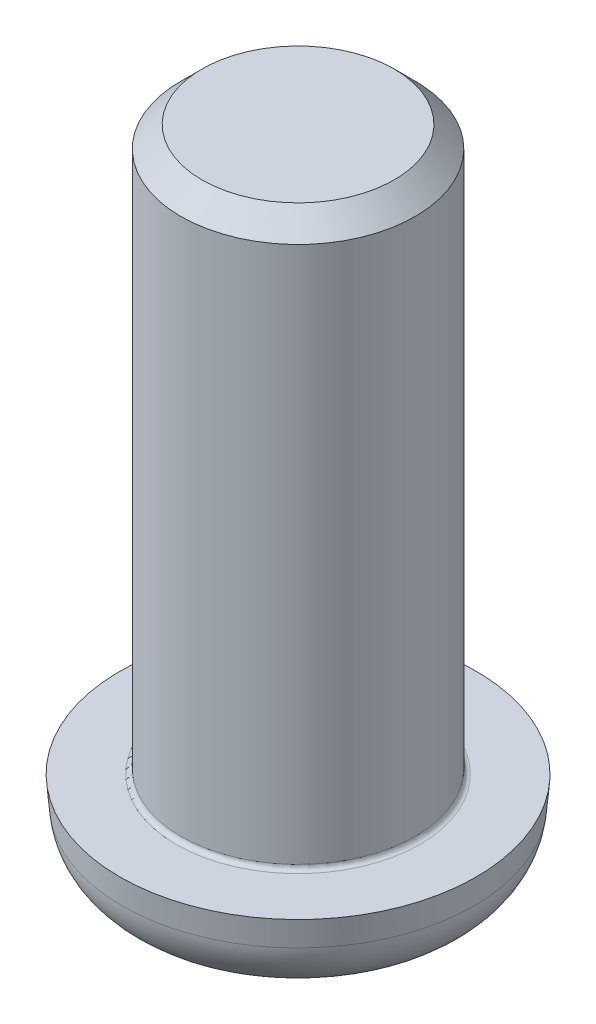
ISO-10303-21;
HEADER;
FILE_DESCRIPTION(('STEP AP214'),'2;1');
FILE_NAME('part.step','',(''),(''),'','','');
FILE_SCHEMA(('AUTOMOTIVE_DESIGN { 1 0 10303 214 1 1 1 1 }'));
ENDSEC;
DATA;
#1=APPLICATION_CONTEXT('core data for automotive mechanical design processes');
#2=APPLICATION_PROTOCOL_DEFINITION('international standard','automotive_design',2000,#1);
#3=PRODUCT_CONTEXT('',#1,'mechanical');
#4=PRODUCT('Part','Part','',(#3));
#5=PRODUCT_RELATED_PRODUCT_CATEGORY('part','',(#4));
#6=PRODUCT_DEFINITION_FORMATION('','',#4);
#7=PRODUCT_DEFINITION_CONTEXT('part definition',#1,'design');
#8=PRODUCT_DEFINITION('design','',#6,#7);
#9=PRODUCT_DEFINITION_SHAPE('','',#8);
#10=(LENGTH_UNIT() NAMED_UNIT(*) SI_UNIT(.MILLI.,.METRE.));
#11=(NAMED_UNIT(*) PLANE_ANGLE_UNIT() SI_UNIT($,.RADIAN.));
#12=(NAMED_UNIT(*) SI_UNIT($,.STERADIAN.) SOLID_ANGLE_UNIT());
#13=UNCERTAINTY_MEASURE_WITH_UNIT(LENGTH_MEASURE(1.E-05),#10,'distance_accuracy_value','');
#14=(GEOMETRIC_REPRESENTATION_CONTEXT(3) GLOBAL_UNCERTAINTY_ASSIGNED_CONTEXT((#13)) GLOBAL_UNIT_ASSIGNED_CONTEXT((#10,
#11,#12)) REPRESENTATION_CONTEXT('',''));
#15=CARTESIAN_POINT('',(0.,0.,0.));
#16=DIRECTION('',(0.,0.,1.));
#17=DIRECTION('',(1.,0.,0.));
#18=AXIS2_PLACEMENT_3D('',#15,#16,#17);
#19=CARTESIAN_POINT('',(0.,0.,1.25));
#20=DIRECTION('',(0.,1.,0.));
#21=DIRECTION('',(0.,0.,1.));
#22=AXIS2_PLACEMENT_3D('',#19,#20,#21);
#23=PLANE('',#22);
#24=CARTESIAN_POINT('',(0.,0.,0.));
#25=DIRECTION('',(0.,1.,0.));
#26=DIRECTION('',(0.,0.,1.));
#27=AXIS2_PLACEMENT_3D('',#24,#25,#26);
#28=CIRCLE('',#27,1.3);
#29=CARTESIAN_POINT('',(0.,0.,1.3));
#30=VERTEX_POINT('',#29);
#31=EDGE_CURVE('E245',#30,#30,#28,.F.);
#32=ORIENTED_EDGE('',*,*,#31,.T.);
#33=EDGE_LOOP('',(#32));
#34=FACE_BOUND('',#33,.T.);
#35=CARTESIAN_POINT('',(0.,0.,0.));
#36=DIRECTION('',(0.,1.,0.));
#37=DIRECTION('',(0.,0.,1.));
#38=AXIS2_PLACEMENT_3D('',#35,#36,#37);
#39=CIRCLE('',#38,1.9);
#40=CARTESIAN_POINT('',(0.,0.,1.9));
#41=VERTEX_POINT('',#40);
#42=EDGE_CURVE('E233',#41,#41,#39,.T.);
#43=ORIENTED_EDGE('',*,*,#42,.T.);
#44=EDGE_LOOP('',(#43));
#45=FACE_BOUND('',#44,.T.);
#46=ADVANCED_FACE('F37',(#34,#45),#23,.T.);
#47=CARTESIAN_POINT('',(0.,0.,0.));
#48=DIRECTION('',(0.,1.,0.));
#49=DIRECTION('',(0.,0.,1.));
#50=AXIS2_PLACEMENT_3D('',#47,#48,#49);
#51=CONICAL_SURFACE('',#50,1.9,0.0872664625997169);
#52=CARTESIAN_POINT('',(0.,-0.28,0.));
#53=DIRECTION('',(0.,1.,0.));
#54=DIRECTION('',(0.,0.,1.));
#55=AXIS2_PLACEMENT_3D('',#52,#53,#54);
#56=CIRCLE('',#55,1.87550317421274);
#57=CARTESIAN_POINT('',(0.,-0.28,1.87550317421274));
#58=VERTEX_POINT('',#57);
#59=EDGE_CURVE('E181',#58,#58,#56,.T.);
#60=ORIENTED_EDGE('',*,*,#59,.T.);
#61=EDGE_LOOP('',(#60));
#62=FACE_BOUND('',#61,.T.);
#63=ORIENTED_EDGE('',*,*,#42,.F.);
#64=EDGE_LOOP('',(#63));
#65=FACE_BOUND('',#64,.T.);
#66=ADVANCED_FACE('F262',(#62,#65),#51,.T.);
#67=CARTESIAN_POINT('',(0.,-0.224011361782265,0.));
#68=DIRECTION('',(0.,1.,0.));
#69=DIRECTION('',(0.,0.,1.));
#70=AXIS2_PLACEMENT_3D('',#67,#68,#69);
#71=TOROIDAL_SURFACE('',#70,1.23555011102365,0.642397579925844);
#72=CARTESIAN_POINT('',(0.,-0.769977710221994,0.));
#73=DIRECTION('',(0.,1.,0.));
#74=DIRECTION('',(0.,0.,1.));
#75=AXIS2_PLACEMENT_3D('',#72,#73,#74);
#76=CIRCLE('',#75,1.57406953006186);
#77=CARTESIAN_POINT('',(0.,-0.769977710221994,1.57406953006186));
#78=VERTEX_POINT('',#77);
#79=EDGE_CURVE('E236',#78,#78,#76,.T.);
#80=ORIENTED_EDGE('',*,*,#79,.T.);
#81=EDGE_LOOP('',(#80));
#82=FACE_BOUND('',#81,.T.);
#83=ORIENTED_EDGE('',*,*,#59,.F.);
#84=EDGE_LOOP('',(#83));
#85=FACE_BOUND('',#84,.T.);
#86=ADVANCED_FACE('F268',(#82,#85),#71,.T.);
#87=CARTESIAN_POINT('',(0.,-0.8,0.));
#88=DIRECTION('',(0.,-1.,0.));
#89=DIRECTION('',(0.,0.,-1.));
#90=AXIS2_PLACEMENT_3D('',#87,#88,#89);
#91=PLANE('',#90);
#92=DIRECTION('',(0.,0.,-1.));
#93=VECTOR('',#92,1.);
#94=CARTESIAN_POINT('',(-0.1785,-0.8,1.05));
#95=LINE('',#94,#93);
#96=CARTESIAN_POINT('',(-0.1785,-0.8,1.05));
#97=VERTEX_POINT('',#96);
#98=CARTESIAN_POINT('',(-0.1785,-0.8,0.1785));
#99=VERTEX_POINT('',#98);
#100=EDGE_CURVE('E52',#97,#99,#95,.T.);
#101=ORIENTED_EDGE('',*,*,#100,.F.);
#102=DIRECTION('',(-1.,0.,0.));
#103=VECTOR('',#102,1.);
#104=CARTESIAN_POINT('',(-0.1785,-0.8,1.05));
#105=LINE('',#104,#103);
#106=CARTESIAN_POINT('',(0.1785,-0.8,1.05));
#107=VERTEX_POINT('',#106);
#108=EDGE_CURVE('E177',#107,#97,#105,.T.);
#109=ORIENTED_EDGE('',*,*,#108,.F.);
#110=DIRECTION('',(0.,0.,1.));
#111=VECTOR('',#110,1.);
#112=CARTESIAN_POINT('',(0.1785,-0.8,1.05));
#113=LINE('',#112,#111);
#114=CARTESIAN_POINT('',(0.178500000000001,-0.8,0.1785));
#115=VERTEX_POINT('',#114);
#116=EDGE_CURVE('E175',#115,#107,#113,.T.);
#117=ORIENTED_EDGE('',*,*,#116,.F.);
#118=DIRECTION('',(-1.,0.,0.));
#119=VECTOR('',#118,1.);
#120=CARTESIAN_POINT('',(0.178500000000001,-0.8,0.1785));
#121=LINE('',#120,#119);
#122=CARTESIAN_POINT('',(1.05,-0.8,0.1785));
#123=VERTEX_POINT('',#122);
#124=EDGE_CURVE('E172',#123,#115,#121,.T.);
#125=ORIENTED_EDGE('',*,*,#124,.F.);
#126=DIRECTION('',(0.,0.,1.));
#127=VECTOR('',#126,1.);
#128=CARTESIAN_POINT('',(1.05,-0.8,0.1785));
#129=LINE('',#128,#127);
#130=CARTESIAN_POINT('',(1.05,-0.8,-0.1785));
#131=VERTEX_POINT('',#130);
#132=EDGE_CURVE('E169',#131,#123,#129,.T.);
#133=ORIENTED_EDGE('',*,*,#132,.F.);
#134=DIRECTION('',(1.,0.,0.));
#135=VECTOR('',#134,1.);
#136=CARTESIAN_POINT('',(0.178500000000001,-0.8,-0.1785));
#137=LINE('',#136,#135);
#138=CARTESIAN_POINT('',(0.178500000000001,-0.8,-0.1785));
#139=VERTEX_POINT('',#138);
#140=EDGE_CURVE('E166',#139,#131,#137,.T.);
#141=ORIENTED_EDGE('',*,*,#140,.F.);
#142=DIRECTION('',(0.,0.,1.));
#143=VECTOR('',#142,1.);
#144=CARTESIAN_POINT('',(0.178500000000001,-0.8,-0.1785));
#145=LINE('',#144,#143);
#146=CARTESIAN_POINT('',(0.178500000000001,-0.8,-1.05));
#147=VERTEX_POINT('',#146);
#148=EDGE_CURVE('E163',#147,#139,#145,.T.);
#149=ORIENTED_EDGE('',*,*,#148,.F.);
#150=DIRECTION('',(1.,0.,0.));
#151=VECTOR('',#150,1.);
#152=CARTESIAN_POINT('',(-0.1785,-0.8,-1.05));
#153=LINE('',#152,#151);
#154=CARTESIAN_POINT('',(-0.1785,-0.8,-1.05));
#155=VERTEX_POINT('',#154);
#156=EDGE_CURVE('E160',#155,#147,#153,.T.);
#157=ORIENTED_EDGE('',*,*,#156,.F.);
#158=DIRECTION('',(0.,0.,-1.));
#159=VECTOR('',#158,1.);
#160=CARTESIAN_POINT('',(-0.1785,-0.8,-0.1785));
#161=LINE('',#160,#159);
#162=CARTESIAN_POINT('',(-0.1785,-0.8,-0.1785));
#163=VERTEX_POINT('',#162);
#164=EDGE_CURVE('E154',#163,#155,#161,.T.);
#165=ORIENTED_EDGE('',*,*,#164,.F.);
#166=DIRECTION('',(1.,0.,0.));
#167=VECTOR('',#166,1.);
#168=CARTESIAN_POINT('',(-1.05,-0.8,-0.1785));
#169=LINE('',#168,#167);
#170=CARTESIAN_POINT('',(-1.05,-0.8,-0.1785));
#171=VERTEX_POINT('',#170);
#172=EDGE_CURVE('E152',#171,#163,#169,.T.);
#173=ORIENTED_EDGE('',*,*,#172,.F.);
#174=DIRECTION('',(0.,0.,-1.));
#175=VECTOR('',#174,1.);
#176=CARTESIAN_POINT('',(-1.05,-0.8,0.1785));
#177=LINE('',#176,#175);
#178=CARTESIAN_POINT('',(-1.05,-0.8,0.1785));
#179=VERTEX_POINT('',#178);
#180=EDGE_CURVE('E135',#179,#171,#177,.T.);
#181=ORIENTED_EDGE('',*,*,#180,.F.);
#182=DIRECTION('',(-1.,0.,0.));
#183=VECTOR('',#182,1.);
#184=CARTESIAN_POINT('',(-1.05,-0.8,0.1785));
#185=LINE('',#184,#183);
#186=EDGE_CURVE('E144',#99,#179,#185,.T.);
#187=ORIENTED_EDGE('',*,*,#186,.F.);
#188=EDGE_LOOP('',(#101,#109,#117,#125,#133,#141,#149,#157,#165,#173,#181,#187));
#189=FACE_BOUND('',#188,.T.);
#190=CARTESIAN_POINT('',(0.,-0.8,0.));
#191=DIRECTION('',(0.,-1.,0.));
#192=DIRECTION('',(0.,0.,-1.));
#193=AXIS2_PLACEMENT_3D('',#190,#191,#192);
#194=CIRCLE('',#193,1.46867703494153);
#195=CARTESIAN_POINT('',(0.,-0.8,-1.46867703494154));
#196=VERTEX_POINT('',#195);
#197=EDGE_CURVE('E239',#196,#196,#194,.T.);
#198=ORIENTED_EDGE('',*,*,#197,.T.);
#199=EDGE_LOOP('',(#198));
#200=FACE_BOUND('',#199,.T.);
#201=ADVANCED_FACE('F148',(#189,#200),#91,.T.);
#202=CARTESIAN_POINT('',(0.,6.,1.25));
#203=DIRECTION('',(0.,1.,0.));
#204=DIRECTION('',(0.,0.,1.));
#205=AXIS2_PLACEMENT_3D('',#202,#203,#204);
#206=PLANE('',#205);
#207=CARTESIAN_POINT('',(0.,6.,0.));
#208=DIRECTION('',(0.,1.,0.));
#209=DIRECTION('',(0.,0.,1.));
#210=AXIS2_PLACEMENT_3D('',#207,#208,#209);
#211=CIRCLE('',#210,1.025);
#212=CARTESIAN_POINT('',(0.,6.,1.025));
#213=VERTEX_POINT('',#212);
#214=EDGE_CURVE('E45',#213,#213,#211,.T.);
#215=ORIENTED_EDGE('',*,*,#214,.T.);
#216=EDGE_LOOP('',(#215));
#217=FACE_BOUND('',#216,.T.);
#218=ADVANCED_FACE('F250',(#217),#206,.T.);
#219=CARTESIAN_POINT('',(0.,6.,0.));
#220=DIRECTION('',(0.,1.,0.));
#221=DIRECTION('',(0.,0.,1.));
#222=AXIS2_PLACEMENT_3D('',#219,#220,#221);
#223=CYLINDRICAL_SURFACE('',#222,1.25);
#224=CARTESIAN_POINT('',(0.,5.775,0.));
#225=DIRECTION('',(0.,1.,0.));
#226=DIRECTION('',(0.,0.,1.));
#227=AXIS2_PLACEMENT_3D('',#224,#225,#226);
#228=CIRCLE('',#227,1.25);
#229=CARTESIAN_POINT('',(0.,5.775,1.25));
#230=VERTEX_POINT('',#229);
#231=EDGE_CURVE('E11',#230,#230,#228,.F.);
#232=ORIENTED_EDGE('',*,*,#231,.T.);
#233=EDGE_LOOP('',(#232));
#234=FACE_BOUND('',#233,.T.);
#235=CARTESIAN_POINT('',(0.,0.0499999999999997,0.));
#236=DIRECTION('',(0.,1.,0.));
#237=DIRECTION('',(0.,0.,1.));
#238=AXIS2_PLACEMENT_3D('',#235,#236,#237);
#239=CIRCLE('',#238,1.25);
#240=CARTESIAN_POINT('',(0.,0.0499999999999995,1.25));
#241=VERTEX_POINT('',#240);
#242=EDGE_CURVE('E242',#241,#241,#239,.T.);
#243=ORIENTED_EDGE('',*,*,#242,.T.);
#244=EDGE_LOOP('',(#243));
#245=FACE_BOUND('',#244,.T.);
#246=ADVANCED_FACE('F277',(#234,#245),#223,.T.);
#247=CARTESIAN_POINT('',(0.,-0.6,0.));
#248=DIRECTION('',(0.,-1.,0.));
#249=DIRECTION('',(0.,0.,-1.));
#250=AXIS2_PLACEMENT_3D('',#247,#248,#249);
#251=TOROIDAL_SURFACE('',#250,1.46867703494153,0.2);
#252=ORIENTED_EDGE('',*,*,#197,.F.);
#253=EDGE_LOOP('',(#252));
#254=FACE_BOUND('',#253,.T.);
#255=ORIENTED_EDGE('',*,*,#79,.F.);
#256=EDGE_LOOP('',(#255));
#257=FACE_BOUND('',#256,.T.);
#258=ADVANCED_FACE('F274',(#254,#257),#251,.T.);
#259=CARTESIAN_POINT('',(-0.1785,-0.8,1.05));
#260=DIRECTION('',(-0.999390827019096,0.034899496702501,0.));
#261=DIRECTION('',(-0.034899496702501,-0.999390827019096,0.));
#262=AXIS2_PLACEMENT_3D('',#259,#260,#261);
#263=PLANE('',#262);
#264=ORIENTED_EDGE('',*,*,#100,.T.);
#265=DIRECTION('',(-0.0348782627423747,-0.998782765958718,0.0348782627423746));
#266=VECTOR('',#265,1.);
#267=CARTESIAN_POINT('',(-0.179560173834194,-0.830359406439888,0.179560173834193));
#268=LINE('',#267,#266);
#269=CARTESIAN_POINT('',(-0.125420430372544,0.72,0.125420430372543));
#270=VERTEX_POINT('',#269);
#271=EDGE_CURVE('E95',#270,#99,#268,.T.);
#272=ORIENTED_EDGE('',*,*,#271,.F.);
#273=DIRECTION('',(0.,0.,-1.));
#274=VECTOR('',#273,1.);
#275=CARTESIAN_POINT('',(-0.125420430372544,0.72,-0.1785));
#276=LINE('',#275,#274);
#277=CARTESIAN_POINT('',(-0.125420430372544,0.72,0.996920430372544));
#278=VERTEX_POINT('',#277);
#279=EDGE_CURVE('E179',#278,#270,#276,.T.);
#280=ORIENTED_EDGE('',*,*,#279,.F.);
#281=DIRECTION('',(-0.0348782627423747,-0.998782765958718,0.0348782627423746));
#282=VECTOR('',#281,1.);
#283=CARTESIAN_POINT('',(-0.1785,-0.8,1.05));
#284=LINE('',#283,#282);
#285=EDGE_CURVE('E60',#278,#97,#284,.T.);
#286=ORIENTED_EDGE('',*,*,#285,.T.);
#287=EDGE_LOOP('',(#264,#272,#280,#286));
#288=FACE_BOUND('',#287,.T.);
#289=ADVANCED_FACE('F276',(#288),#263,.F.);
#290=CARTESIAN_POINT('',(-0.1785,-0.8,1.05));
#291=DIRECTION('',(0.,0.0348994967025009,0.999390827019096));
#292=DIRECTION('',(0.,-0.999390827019096,0.0348994967025009));
#293=AXIS2_PLACEMENT_3D('',#290,#291,#292);
#294=PLANE('',#293);
#295=ORIENTED_EDGE('',*,*,#108,.T.);
#296=ORIENTED_EDGE('',*,*,#285,.F.);
#297=DIRECTION('',(-1.,0.,0.));
#298=VECTOR('',#297,1.);
#299=CARTESIAN_POINT('',(-0.1785,0.72,0.996920430372544));
#300=LINE('',#299,#298);
#301=CARTESIAN_POINT('',(0.125420430372543,0.72,0.996920430372544));
#302=VERTEX_POINT('',#301);
#303=EDGE_CURVE('E182',#302,#278,#300,.T.);
#304=ORIENTED_EDGE('',*,*,#303,.F.);
#305=DIRECTION('',(0.0348782627423746,-0.998782765958718,0.0348782627423746));
#306=VECTOR('',#305,1.);
#307=CARTESIAN_POINT('',(0.1785,-0.8,1.05));
#308=LINE('',#307,#306);
#309=EDGE_CURVE('E100',#302,#107,#308,.T.);
#310=ORIENTED_EDGE('',*,*,#309,.T.);
#311=EDGE_LOOP('',(#295,#296,#304,#310));
#312=FACE_BOUND('',#311,.T.);
#313=ADVANCED_FACE('F283',(#312),#294,.F.);
#314=CARTESIAN_POINT('',(0.1785,-0.8,1.05));
#315=DIRECTION('',(0.999390827019096,0.034899496702501,0.));
#316=DIRECTION('',(-0.034899496702501,0.999390827019096,0.));
#317=AXIS2_PLACEMENT_3D('',#314,#315,#316);
#318=PLANE('',#317);
#319=ORIENTED_EDGE('',*,*,#116,.T.);
#320=ORIENTED_EDGE('',*,*,#309,.F.);
#321=DIRECTION('',(0.,0.,1.));
#322=VECTOR('',#321,1.);
#323=CARTESIAN_POINT('',(0.125420430372545,0.72,-0.178499999999999));
#324=LINE('',#323,#322);
#325=CARTESIAN_POINT('',(0.125420430372544,0.72,0.125420430372543));
#326=VERTEX_POINT('',#325);
#327=EDGE_CURVE('E205',#326,#302,#324,.T.);
#328=ORIENTED_EDGE('',*,*,#327,.F.);
#329=DIRECTION('',(0.0348782627423746,-0.998782765958718,0.0348782627423746));
#330=VECTOR('',#329,1.);
#331=CARTESIAN_POINT('',(0.179560173834195,-0.830359406439888,0.179560173834194));
#332=LINE('',#331,#330);
#333=EDGE_CURVE('E197',#326,#115,#332,.T.);
#334=ORIENTED_EDGE('',*,*,#333,.T.);
#335=EDGE_LOOP('',(#319,#320,#328,#334));
#336=FACE_BOUND('',#335,.T.);
#337=ADVANCED_FACE('F305',(#336),#318,.F.);
#338=CARTESIAN_POINT('',(0.178500000000001,-0.8,0.1785));
#339=DIRECTION('',(0.,0.0348994967025009,0.999390827019096));
#340=DIRECTION('',(0.,-0.999390827019096,0.0348994967025009));
#341=AXIS2_PLACEMENT_3D('',#338,#339,#340);
#342=PLANE('',#341);
#343=ORIENTED_EDGE('',*,*,#124,.T.);
#344=ORIENTED_EDGE('',*,*,#333,.F.);
#345=DIRECTION('',(-1.,0.,0.));
#346=VECTOR('',#345,1.);
#347=CARTESIAN_POINT('',(-0.1785,0.72,0.125420430372543));
#348=LINE('',#347,#346);
#349=CARTESIAN_POINT('',(0.996920430372544,0.72,0.125420430372543));
#350=VERTEX_POINT('',#349);
#351=EDGE_CURVE('E208',#350,#326,#348,.T.);
#352=ORIENTED_EDGE('',*,*,#351,.F.);
#353=DIRECTION('',(0.0348782627423747,-0.998782765958718,0.0348782627423746));
#354=VECTOR('',#353,1.);
#355=CARTESIAN_POINT('',(1.05,-0.8,0.1785));
#356=LINE('',#355,#354);
#357=EDGE_CURVE('E195',#350,#123,#356,.T.);
#358=ORIENTED_EDGE('',*,*,#357,.T.);
#359=EDGE_LOOP('',(#343,#344,#352,#358));
#360=FACE_BOUND('',#359,.T.);
#361=ADVANCED_FACE('F308',(#360),#342,.F.);
#362=CARTESIAN_POINT('',(1.05,-0.8,0.1785));
#363=DIRECTION('',(0.999390827019096,0.034899496702501,0.));
#364=DIRECTION('',(-0.0348994967025011,0.999390827019096,0.));
#365=AXIS2_PLACEMENT_3D('',#362,#363,#364);
#366=PLANE('',#365);
#367=ORIENTED_EDGE('',*,*,#132,.T.);
#368=ORIENTED_EDGE('',*,*,#357,.F.);
#369=DIRECTION('',(0.,0.,1.));
#370=VECTOR('',#369,1.);
#371=CARTESIAN_POINT('',(0.996920430372544,0.72,-0.178499999999999));
#372=LINE('',#371,#370);
#373=CARTESIAN_POINT('',(0.996920430372544,0.72,-0.125420430372543));
#374=VERTEX_POINT('',#373);
#375=EDGE_CURVE('E211',#374,#350,#372,.T.);
#376=ORIENTED_EDGE('',*,*,#375,.F.);
#377=DIRECTION('',(0.0348782627423747,-0.998782765958718,-0.0348782627423748));
#378=VECTOR('',#377,1.);
#379=CARTESIAN_POINT('',(1.04893982616581,-0.769640593560112,-0.177439826165807));
#380=LINE('',#379,#378);
#381=EDGE_CURVE('E193',#374,#131,#380,.T.);
#382=ORIENTED_EDGE('',*,*,#381,.T.);
#383=EDGE_LOOP('',(#367,#368,#376,#382));
#384=FACE_BOUND('',#383,.T.);
#385=ADVANCED_FACE('F312',(#384),#366,.F.);
#386=CARTESIAN_POINT('',(0.178500000000001,-0.8,-0.1785));
#387=DIRECTION('',(0.,0.0348994967025012,-0.999390827019096));
#388=DIRECTION('',(0.,0.999390827019096,0.0348994967025012));
#389=AXIS2_PLACEMENT_3D('',#386,#387,#388);
#390=PLANE('',#389);
#391=ORIENTED_EDGE('',*,*,#140,.T.);
#392=ORIENTED_EDGE('',*,*,#381,.F.);
#393=DIRECTION('',(1.,0.,0.));
#394=VECTOR('',#393,1.);
#395=CARTESIAN_POINT('',(-0.1785,0.72,-0.125420430372543));
#396=LINE('',#395,#394);
#397=CARTESIAN_POINT('',(0.125420430372544,0.72,-0.125420430372543));
#398=VERTEX_POINT('',#397);
#399=EDGE_CURVE('E214',#398,#374,#396,.T.);
#400=ORIENTED_EDGE('',*,*,#399,.F.);
#401=DIRECTION('',(0.0348782627423747,-0.998782765958718,-0.0348782627423748));
#402=VECTOR('',#401,1.);
#403=CARTESIAN_POINT('',(0.178500000000001,-0.8,-0.1785));
#404=LINE('',#403,#402);
#405=EDGE_CURVE('E191',#398,#139,#404,.T.);
#406=ORIENTED_EDGE('',*,*,#405,.T.);
#407=EDGE_LOOP('',(#391,#392,#400,#406));
#408=FACE_BOUND('',#407,.T.);
#409=ADVANCED_FACE('F316',(#408),#390,.F.);
#410=CARTESIAN_POINT('',(0.178500000000001,-0.8,-0.1785));
#411=DIRECTION('',(0.999390827019096,0.034899496702501,0.));
#412=DIRECTION('',(-0.034899496702501,0.999390827019096,0.));
#413=AXIS2_PLACEMENT_3D('',#410,#411,#412);
#414=PLANE('',#413);
#415=ORIENTED_EDGE('',*,*,#148,.T.);
#416=ORIENTED_EDGE('',*,*,#405,.F.);
#417=DIRECTION('',(0.,0.,1.));
#418=VECTOR('',#417,1.);
#419=CARTESIAN_POINT('',(0.125420430372544,0.72,-0.1785));
#420=LINE('',#419,#418);
#421=CARTESIAN_POINT('',(0.125420430372544,0.72,-0.996920430372543));
#422=VERTEX_POINT('',#421);
#423=EDGE_CURVE('E217',#422,#398,#420,.T.);
#424=ORIENTED_EDGE('',*,*,#423,.F.);
#425=DIRECTION('',(0.0348782627423747,-0.998782765958718,-0.0348782627423748));
#426=VECTOR('',#425,1.);
#427=CARTESIAN_POINT('',(0.178065711923344,-0.787563616639082,-1.04956571192334));
#428=LINE('',#427,#426);
#429=EDGE_CURVE('E189',#422,#147,#428,.T.);
#430=ORIENTED_EDGE('',*,*,#429,.T.);
#431=EDGE_LOOP('',(#415,#416,#424,#430));
#432=FACE_BOUND('',#431,.T.);
#433=ADVANCED_FACE('F320',(#432),#414,.F.);
#434=CARTESIAN_POINT('',(-0.1785,-0.8,-1.05));
#435=DIRECTION('',(0.,0.0348994967025012,-0.999390827019096));
#436=DIRECTION('',(0.,0.999390827019096,0.0348994967025012));
#437=AXIS2_PLACEMENT_3D('',#434,#435,#436);
#438=PLANE('',#437);
#439=ORIENTED_EDGE('',*,*,#156,.T.);
#440=ORIENTED_EDGE('',*,*,#429,.F.);
#441=DIRECTION('',(1.,0.,0.));
#442=VECTOR('',#441,1.);
#443=CARTESIAN_POINT('',(-0.1785,0.72,-0.996920430372543));
#444=LINE('',#443,#442);
#445=CARTESIAN_POINT('',(-0.125420430372544,0.72,-0.996920430372543));
#446=VERTEX_POINT('',#445);
#447=EDGE_CURVE('E220',#446,#422,#444,.T.);
#448=ORIENTED_EDGE('',*,*,#447,.F.);
#449=DIRECTION('',(-0.0348782627423747,-0.998782765958718,-0.0348782627423748));
#450=VECTOR('',#449,1.);
#451=CARTESIAN_POINT('',(-0.177439826165807,-0.769640593560112,-1.04893982616581));
#452=LINE('',#451,#450);
#453=EDGE_CURVE('E187',#446,#155,#452,.T.);
#454=ORIENTED_EDGE('',*,*,#453,.T.);
#455=EDGE_LOOP('',(#439,#440,#448,#454));
#456=FACE_BOUND('',#455,.T.);
#457=ADVANCED_FACE('F324',(#456),#438,.F.);
#458=CARTESIAN_POINT('',(-0.1785,-0.8,-0.1785));
#459=DIRECTION('',(-0.999390827019096,0.034899496702501,0.));
#460=DIRECTION('',(-0.034899496702501,-0.999390827019096,0.));
#461=AXIS2_PLACEMENT_3D('',#458,#459,#460);
#462=PLANE('',#461);
#463=ORIENTED_EDGE('',*,*,#164,.T.);
#464=ORIENTED_EDGE('',*,*,#453,.F.);
#465=DIRECTION('',(0.,0.,-1.));
#466=VECTOR('',#465,1.);
#467=CARTESIAN_POINT('',(-0.125420430372544,0.72,-0.1785));
#468=LINE('',#467,#466);
#469=CARTESIAN_POINT('',(-0.125420430372544,0.72,-0.125420430372543));
#470=VERTEX_POINT('',#469);
#471=EDGE_CURVE('E223',#470,#446,#468,.T.);
#472=ORIENTED_EDGE('',*,*,#471,.F.);
#473=DIRECTION('',(-0.0348782627423747,-0.998782765958718,-0.0348782627423748));
#474=VECTOR('',#473,1.);
#475=CARTESIAN_POINT('',(-0.1785,-0.8,-0.1785));
#476=LINE('',#475,#474);
#477=EDGE_CURVE('E185',#470,#163,#476,.T.);
#478=ORIENTED_EDGE('',*,*,#477,.T.);
#479=EDGE_LOOP('',(#463,#464,#472,#478));
#480=FACE_BOUND('',#479,.T.);
#481=ADVANCED_FACE('F328',(#480),#462,.F.);
#482=CARTESIAN_POINT('',(-1.05,-0.8,-0.1785));
#483=DIRECTION('',(0.,0.0348994967025012,-0.999390827019096));
#484=DIRECTION('',(0.,0.999390827019096,0.0348994967025012));
#485=AXIS2_PLACEMENT_3D('',#482,#483,#484);
#486=PLANE('',#485);
#487=ORIENTED_EDGE('',*,*,#172,.T.);
#488=ORIENTED_EDGE('',*,*,#477,.F.);
#489=DIRECTION('',(1.,0.,0.));
#490=VECTOR('',#489,1.);
#491=CARTESIAN_POINT('',(-0.1785,0.72,-0.125420430372543));
#492=LINE('',#491,#490);
#493=CARTESIAN_POINT('',(-0.996920430372544,0.72,-0.125420430372543));
#494=VERTEX_POINT('',#493);
#495=EDGE_CURVE('E226',#494,#470,#492,.T.);
#496=ORIENTED_EDGE('',*,*,#495,.F.);
#497=DIRECTION('',(-0.0348782627423747,-0.998782765958718,-0.0348782627423748));
#498=VECTOR('',#497,1.);
#499=CARTESIAN_POINT('',(-1.04956571192334,-0.787563616639082,-0.178065711923343));
#500=LINE('',#499,#498);
#501=EDGE_CURVE('E141',#494,#171,#500,.T.);
#502=ORIENTED_EDGE('',*,*,#501,.T.);
#503=EDGE_LOOP('',(#487,#488,#496,#502));
#504=FACE_BOUND('',#503,.T.);
#505=ADVANCED_FACE('F332',(#504),#486,.F.);
#506=CARTESIAN_POINT('',(-1.05,-0.8,0.1785));
#507=DIRECTION('',(-0.999390827019096,0.034899496702501,0.));
#508=DIRECTION('',(-0.034899496702501,-0.999390827019096,0.));
#509=AXIS2_PLACEMENT_3D('',#506,#507,#508);
#510=PLANE('',#509);
#511=ORIENTED_EDGE('',*,*,#180,.T.);
#512=ORIENTED_EDGE('',*,*,#501,.F.);
#513=DIRECTION('',(0.,0.,-1.));
#514=VECTOR('',#513,1.);
#515=CARTESIAN_POINT('',(-0.996920430372543,0.72,-0.178499999999999));
#516=LINE('',#515,#514);
#517=CARTESIAN_POINT('',(-0.996920430372543,0.72,0.125420430372543));
#518=VERTEX_POINT('',#517);
#519=EDGE_CURVE('E138',#518,#494,#516,.T.);
#520=ORIENTED_EDGE('',*,*,#519,.F.);
#521=DIRECTION('',(-0.0348782627423747,-0.998782765958718,0.0348782627423746));
#522=VECTOR('',#521,1.);
#523=CARTESIAN_POINT('',(-1.05,-0.8,0.1785));
#524=LINE('',#523,#522);
#525=EDGE_CURVE('E131',#518,#179,#524,.T.);
#526=ORIENTED_EDGE('',*,*,#525,.T.);
#527=EDGE_LOOP('',(#511,#512,#520,#526));
#528=FACE_BOUND('',#527,.T.);
#529=ADVANCED_FACE('F133',(#528),#510,.F.);
#530=CARTESIAN_POINT('',(-1.05,-0.8,0.1785));
#531=DIRECTION('',(0.,0.0348994967025009,0.999390827019096));
#532=DIRECTION('',(0.,-0.999390827019096,0.0348994967025009));
#533=AXIS2_PLACEMENT_3D('',#530,#531,#532);
#534=PLANE('',#533);
#535=ORIENTED_EDGE('',*,*,#186,.T.);
#536=ORIENTED_EDGE('',*,*,#525,.F.);
#537=DIRECTION('',(-1.,0.,0.));
#538=VECTOR('',#537,1.);
#539=CARTESIAN_POINT('',(-0.1785,0.72,0.125420430372543));
#540=LINE('',#539,#538);
#541=EDGE_CURVE('E202',#270,#518,#540,.T.);
#542=ORIENTED_EDGE('',*,*,#541,.F.);
#543=ORIENTED_EDGE('',*,*,#271,.T.);
#544=EDGE_LOOP('',(#535,#536,#542,#543));
#545=FACE_BOUND('',#544,.T.);
#546=ADVANCED_FACE('F145',(#545),#534,.F.);
#547=CARTESIAN_POINT('',(-0.1785,0.72,-0.1785));
#548=DIRECTION('',(0.,-1.,0.));
#549=DIRECTION('',(0.,0.,-1.));
#550=AXIS2_PLACEMENT_3D('',#547,#548,#549);
#551=PLANE('',#550);
#552=ORIENTED_EDGE('',*,*,#279,.T.);
#553=ORIENTED_EDGE('',*,*,#541,.T.);
#554=ORIENTED_EDGE('',*,*,#519,.T.);
#555=ORIENTED_EDGE('',*,*,#495,.T.);
#556=ORIENTED_EDGE('',*,*,#471,.T.);
#557=ORIENTED_EDGE('',*,*,#447,.T.);
#558=ORIENTED_EDGE('',*,*,#423,.T.);
#559=ORIENTED_EDGE('',*,*,#399,.T.);
#560=ORIENTED_EDGE('',*,*,#375,.T.);
#561=ORIENTED_EDGE('',*,*,#351,.T.);
#562=ORIENTED_EDGE('',*,*,#327,.T.);
#563=ORIENTED_EDGE('',*,*,#303,.T.);
#564=EDGE_LOOP('',(#552,#553,#554,#555,#556,#557,#558,#559,#560,#561,#562,#563));
#565=FACE_BOUND('',#564,.T.);
#566=ADVANCED_FACE('F258',(#565),#551,.T.);
#567=CARTESIAN_POINT('',(0.,0.0499999999999997,0.));
#568=DIRECTION('',(0.,1.,0.));
#569=DIRECTION('',(0.,0.,1.));
#570=AXIS2_PLACEMENT_3D('',#567,#568,#569);
#571=TOROIDAL_SURFACE('',#570,1.3,0.05);
#572=ORIENTED_EDGE('',*,*,#31,.F.);
#573=EDGE_LOOP('',(#572));
#574=FACE_BOUND('',#573,.T.);
#575=ORIENTED_EDGE('',*,*,#242,.F.);
#576=EDGE_LOOP('',(#575));
#577=FACE_BOUND('',#576,.T.);
#578=ADVANCED_FACE('F253',(#574,#577),#571,.F.);
#579=CARTESIAN_POINT('',(0.,6.,0.));
#580=DIRECTION('',(0.,-1.,0.));
#581=DIRECTION('',(0.,0.,-1.));
#582=AXIS2_PLACEMENT_3D('',#579,#580,#581);
#583=CONICAL_SURFACE('',#582,1.025,0.78539816339745);
#584=ORIENTED_EDGE('',*,*,#231,.F.);
#585=EDGE_LOOP('',(#584));
#586=FACE_BOUND('',#585,.T.);
#587=ORIENTED_EDGE('',*,*,#214,.F.);
#588=EDGE_LOOP('',(#587));
#589=FACE_BOUND('',#588,.T.);
#590=ADVANCED_FACE('F39',(#586,#589),#583,.T.);
#591=CLOSED_SHELL('',(#46,#66,#86,#201,#218,#246,#258,#289,#313,#337,#361,#385,#409,#433,#457,
#481,#505,#529,#546,#566,#578,#590));
#592=MANIFOLD_SOLID_BREP('B2',#591);
#593=ADVANCED_BREP_SHAPE_REPRESENTATION('',(#18,#592),#14);
#594=SHAPE_DEFINITION_REPRESENTATION(#9,#593);
ENDSEC;
END-ISO-10303-21;
